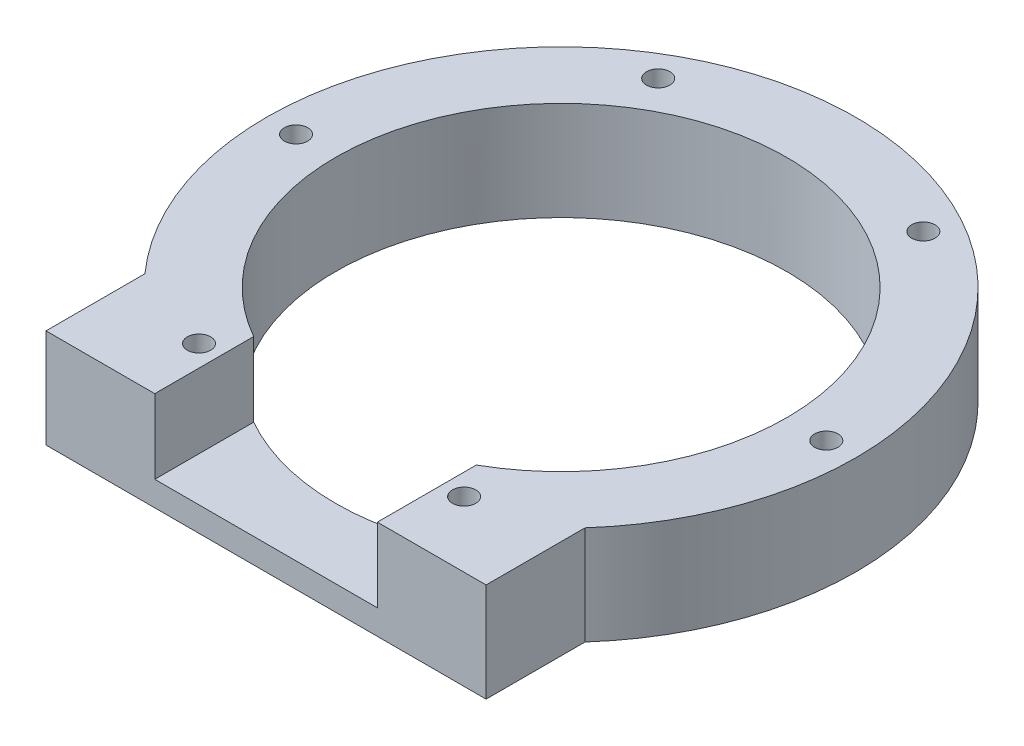
ISO-10303-21;
HEADER;
FILE_DESCRIPTION(('STEP AP214'),'2;1');
FILE_NAME('part.step','',(''),(''),'','','');
FILE_SCHEMA(('AUTOMOTIVE_DESIGN { 1 0 10303 214 1 1 1 1 }'));
ENDSEC;
DATA;
#1=APPLICATION_CONTEXT('core data for automotive mechanical design processes');
#2=APPLICATION_PROTOCOL_DEFINITION('international standard','automotive_design',2000,#1);
#3=PRODUCT_CONTEXT('',#1,'mechanical');
#4=PRODUCT('Part','Part','',(#3));
#5=PRODUCT_RELATED_PRODUCT_CATEGORY('part','',(#4));
#6=PRODUCT_DEFINITION_FORMATION('','',#4);
#7=PRODUCT_DEFINITION_CONTEXT('part definition',#1,'design');
#8=PRODUCT_DEFINITION('design','',#6,#7);
#9=PRODUCT_DEFINITION_SHAPE('','',#8);
#10=(LENGTH_UNIT() NAMED_UNIT(*) SI_UNIT(.MILLI.,.METRE.));
#11=(NAMED_UNIT(*) PLANE_ANGLE_UNIT() SI_UNIT($,.RADIAN.));
#12=(NAMED_UNIT(*) SI_UNIT($,.STERADIAN.) SOLID_ANGLE_UNIT());
#13=UNCERTAINTY_MEASURE_WITH_UNIT(LENGTH_MEASURE(1.E-05),#10,'distance_accuracy_value','');
#14=(GEOMETRIC_REPRESENTATION_CONTEXT(3) GLOBAL_UNCERTAINTY_ASSIGNED_CONTEXT((#13)) GLOBAL_UNIT_ASSIGNED_CONTEXT((#10,
#11,#12)) REPRESENTATION_CONTEXT('',''));
#15=CARTESIAN_POINT('',(0.,0.,0.));
#16=DIRECTION('',(0.,0.,1.));
#17=DIRECTION('',(1.,0.,0.));
#18=AXIS2_PLACEMENT_3D('',#15,#16,#17);
#19=CARTESIAN_POINT('',(14.2875,0.,37.8856562302831));
#20=DIRECTION('',(1.,0.,0.));
#21=DIRECTION('',(0.,0.,-1.));
#22=AXIS2_PLACEMENT_3D('',#19,#20,#21);
#23=PLANE('',#22);
#24=DIRECTION('',(0.,0.,-1.));
#25=VECTOR('',#24,1.);
#26=CARTESIAN_POINT('',(14.2875,3.175,0.));
#27=LINE('',#26,#25);
#28=CARTESIAN_POINT('',(14.2875,3.175,37.8856562302831));
#29=VERTEX_POINT('',#28);
#30=CARTESIAN_POINT('',(14.2875,3.175,25.1856562302831));
#31=VERTEX_POINT('',#30);
#32=EDGE_CURVE('E248',#29,#31,#27,.T.);
#33=ORIENTED_EDGE('',*,*,#32,.F.);
#34=DIRECTION('',(0.,-1.,0.));
#35=VECTOR('',#34,1.);
#36=CARTESIAN_POINT('',(14.2875,0.,37.8856562302831));
#37=LINE('',#36,#35);
#38=CARTESIAN_POINT('',(14.2875,12.7,37.8856562302831));
#39=VERTEX_POINT('',#38);
#40=EDGE_CURVE('E128',#39,#29,#37,.T.);
#41=ORIENTED_EDGE('',*,*,#40,.F.);
#42=DIRECTION('',(0.,0.,-1.));
#43=VECTOR('',#42,1.);
#44=CARTESIAN_POINT('',(14.2875,12.7,37.8856562302831));
#45=LINE('',#44,#43);
#46=CARTESIAN_POINT('',(14.2875,12.7,25.1856562302831));
#47=VERTEX_POINT('',#46);
#48=EDGE_CURVE('E123',#39,#47,#45,.T.);
#49=ORIENTED_EDGE('',*,*,#48,.T.);
#50=DIRECTION('',(0.,-1.,0.));
#51=VECTOR('',#50,1.);
#52=CARTESIAN_POINT('',(14.2875,12.7,25.1856562302831));
#53=LINE('',#52,#51);
#54=EDGE_CURVE('E11',#47,#31,#53,.T.);
#55=ORIENTED_EDGE('',*,*,#54,.T.);
#56=EDGE_LOOP('',(#33,#41,#49,#55));
#57=FACE_BOUND('',#56,.T.);
#58=ADVANCED_FACE('F46',(#57),#23,.F.);
#59=CARTESIAN_POINT('',(-14.2875,12.7,37.8856562302831));
#60=DIRECTION('',(-1.,0.,0.));
#61=DIRECTION('',(0.,0.,1.));
#62=AXIS2_PLACEMENT_3D('',#59,#60,#61);
#63=PLANE('',#62);
#64=DIRECTION('',(0.,0.,1.));
#65=VECTOR('',#64,1.);
#66=CARTESIAN_POINT('',(-14.2875,3.175,0.));
#67=LINE('',#66,#65);
#68=CARTESIAN_POINT('',(-14.2875,3.175,25.1856562302831));
#69=VERTEX_POINT('',#68);
#70=CARTESIAN_POINT('',(-14.2875,3.175,37.8856562302831));
#71=VERTEX_POINT('',#70);
#72=EDGE_CURVE('E62',#69,#71,#67,.T.);
#73=ORIENTED_EDGE('',*,*,#72,.F.);
#74=DIRECTION('',(0.,-1.,0.));
#75=VECTOR('',#74,1.);
#76=CARTESIAN_POINT('',(-14.2875,12.7,25.1856562302831));
#77=LINE('',#76,#75);
#78=CARTESIAN_POINT('',(-14.2875,12.7,25.1856562302831));
#79=VERTEX_POINT('',#78);
#80=EDGE_CURVE('E166',#79,#69,#77,.T.);
#81=ORIENTED_EDGE('',*,*,#80,.F.);
#82=DIRECTION('',(0.,0.,-1.));
#83=VECTOR('',#82,1.);
#84=CARTESIAN_POINT('',(-14.2875,12.7,37.8856562302831));
#85=LINE('',#84,#83);
#86=CARTESIAN_POINT('',(-14.2875,12.7,37.8856562302831));
#87=VERTEX_POINT('',#86);
#88=EDGE_CURVE('E185',#87,#79,#85,.T.);
#89=ORIENTED_EDGE('',*,*,#88,.F.);
#90=DIRECTION('',(0.,1.,0.));
#91=VECTOR('',#90,1.);
#92=CARTESIAN_POINT('',(-14.2875,12.7,37.8856562302831));
#93=LINE('',#92,#91);
#94=EDGE_CURVE('E195',#71,#87,#93,.T.);
#95=ORIENTED_EDGE('',*,*,#94,.F.);
#96=EDGE_LOOP('',(#73,#81,#89,#95));
#97=FACE_BOUND('',#96,.T.);
#98=ADVANCED_FACE('F278',(#97),#63,.F.);
#99=CARTESIAN_POINT('',(0.,0.,0.));
#100=DIRECTION('',(0.,1.,0.));
#101=DIRECTION('',(0.,0.,1.));
#102=AXIS2_PLACEMENT_3D('',#99,#100,#101);
#103=PLANE('',#102);
#104=CARTESIAN_POINT('',(0.,0.,0.));
#105=DIRECTION('',(0.,1.,0.));
#106=DIRECTION('',(0.,0.,1.));
#107=AXIS2_PLACEMENT_3D('',#104,#105,#106);
#108=CIRCLE('',#107,28.956);
#109=CARTESIAN_POINT('',(0.,0.,28.956));
#110=VERTEX_POINT('',#109);
#111=EDGE_CURVE('E167',#110,#110,#108,.T.);
#112=ORIENTED_EDGE('',*,*,#111,.T.);
#113=EDGE_LOOP('',(#112));
#114=FACE_BOUND('',#113,.T.);
#115=CARTESIAN_POINT('',(17.0180000000003,0.,-29.476040643207));
#116=DIRECTION('',(0.,-1.,0.));
#117=DIRECTION('',(0.,0.,-1.));
#118=AXIS2_PLACEMENT_3D('',#115,#116,#117);
#119=CIRCLE('',#118,1.5);
#120=CARTESIAN_POINT('',(17.0180000000003,0.,-30.976040643207));
#121=VERTEX_POINT('',#120);
#122=EDGE_CURVE('E241',#121,#121,#119,.T.);
#123=ORIENTED_EDGE('',*,*,#122,.F.);
#124=EDGE_LOOP('',(#123));
#125=FACE_BOUND('',#124,.T.);
#126=CARTESIAN_POINT('',(34.036,0.,0.));
#127=DIRECTION('',(0.,-1.,0.));
#128=DIRECTION('',(0.,0.,-1.));
#129=AXIS2_PLACEMENT_3D('',#126,#127,#128);
#130=CIRCLE('',#129,1.5);
#131=CARTESIAN_POINT('',(34.036,0.,-1.5));
#132=VERTEX_POINT('',#131);
#133=EDGE_CURVE('E233',#132,#132,#130,.T.);
#134=ORIENTED_EDGE('',*,*,#133,.F.);
#135=EDGE_LOOP('',(#134));
#136=FACE_BOUND('',#135,.T.);
#137=CARTESIAN_POINT('',(-34.036,0.,0.));
#138=DIRECTION('',(0.,-1.,0.));
#139=DIRECTION('',(0.,0.,-1.));
#140=AXIS2_PLACEMENT_3D('',#137,#138,#139);
#141=CIRCLE('',#140,1.5);
#142=CARTESIAN_POINT('',(-34.036,0.,-1.5));
#143=VERTEX_POINT('',#142);
#144=EDGE_CURVE('E217',#143,#143,#141,.T.);
#145=ORIENTED_EDGE('',*,*,#144,.F.);
#146=EDGE_LOOP('',(#145));
#147=FACE_BOUND('',#146,.T.);
#148=CARTESIAN_POINT('',(-17.0180000000001,0.,29.4760406432071));
#149=DIRECTION('',(0.,-1.,0.));
#150=DIRECTION('',(0.,0.,-1.));
#151=AXIS2_PLACEMENT_3D('',#148,#149,#150);
#152=CIRCLE('',#151,1.5);
#153=CARTESIAN_POINT('',(-17.0180000000001,0.,27.9760406432071));
#154=VERTEX_POINT('',#153);
#155=EDGE_CURVE('E209',#154,#154,#152,.T.);
#156=ORIENTED_EDGE('',*,*,#155,.F.);
#157=EDGE_LOOP('',(#156));
#158=FACE_BOUND('',#157,.T.);
#159=CARTESIAN_POINT('',(17.0179999999999,0.,29.4760406432072));
#160=DIRECTION('',(0.,-1.,0.));
#161=DIRECTION('',(0.,0.,-1.));
#162=AXIS2_PLACEMENT_3D('',#159,#160,#161);
#163=CIRCLE('',#162,1.5);
#164=CARTESIAN_POINT('',(17.0179999999999,0.,27.9760406432072));
#165=VERTEX_POINT('',#164);
#166=EDGE_CURVE('E149',#165,#165,#163,.T.);
#167=ORIENTED_EDGE('',*,*,#166,.F.);
#168=EDGE_LOOP('',(#167));
#169=FACE_BOUND('',#168,.T.);
#170=DIRECTION('',(0.,0.,-1.));
#171=VECTOR('',#170,1.);
#172=CARTESIAN_POINT('',(28.2489369047757,0.,37.8856562302831));
#173=LINE('',#172,#171);
#174=CARTESIAN_POINT('',(28.2489369047757,0.,37.8856562302831));
#175=VERTEX_POINT('',#174);
#176=CARTESIAN_POINT('',(28.2489369047757,0.,25.1856562302831));
#177=VERTEX_POINT('',#176);
#178=EDGE_CURVE('E146',#175,#177,#173,.T.);
#179=ORIENTED_EDGE('',*,*,#178,.F.);
#180=DIRECTION('',(1.,0.,0.));
#181=VECTOR('',#180,1.);
#182=CARTESIAN_POINT('',(-28.2489369047757,0.,37.8856562302831));
#183=LINE('',#182,#181);
#184=CARTESIAN_POINT('',(-28.2489369047757,0.,37.8856562302831));
#185=VERTEX_POINT('',#184);
#186=EDGE_CURVE('E133',#185,#175,#183,.T.);
#187=ORIENTED_EDGE('',*,*,#186,.F.);
#188=DIRECTION('',(0.,0.,-1.));
#189=VECTOR('',#188,1.);
#190=CARTESIAN_POINT('',(-28.2489369047757,0.,37.8856562302831));
#191=LINE('',#190,#189);
#192=CARTESIAN_POINT('',(-28.2489369047757,0.,25.1856562302831));
#193=VERTEX_POINT('',#192);
#194=EDGE_CURVE('E152',#185,#193,#191,.T.);
#195=ORIENTED_EDGE('',*,*,#194,.T.);
#196=CARTESIAN_POINT('',(0.,0.,0.));
#197=DIRECTION('',(0.,1.,0.));
#198=DIRECTION('',(0.,0.,1.));
#199=AXIS2_PLACEMENT_3D('',#196,#197,#198);
#200=CIRCLE('',#199,37.846);
#201=EDGE_CURVE('E163',#177,#193,#200,.T.);
#202=ORIENTED_EDGE('',*,*,#201,.F.);
#203=EDGE_LOOP('',(#179,#187,#195,#202));
#204=FACE_BOUND('',#203,.T.);
#205=CARTESIAN_POINT('',(-17.0179999999997,0.,-29.4760406432073));
#206=DIRECTION('',(0.,-1.,0.));
#207=DIRECTION('',(0.,0.,-1.));
#208=AXIS2_PLACEMENT_3D('',#205,#206,#207);
#209=CIRCLE('',#208,1.5);
#210=CARTESIAN_POINT('',(-17.0179999999997,0.,-30.9760406432073));
#211=VERTEX_POINT('',#210);
#212=EDGE_CURVE('E225',#211,#211,#209,.T.);
#213=ORIENTED_EDGE('',*,*,#212,.F.);
#214=EDGE_LOOP('',(#213));
#215=FACE_BOUND('',#214,.T.);
#216=ADVANCED_FACE('F181',(#114,#125,#136,#147,#158,#169,#204,#215),#103,.F.);
#217=CARTESIAN_POINT('',(0.,12.7,0.));
#218=DIRECTION('',(0.,-1.,0.));
#219=DIRECTION('',(0.,0.,-1.));
#220=AXIS2_PLACEMENT_3D('',#217,#218,#219);
#221=CYLINDRICAL_SURFACE('',#220,28.956);
#222=ORIENTED_EDGE('',*,*,#111,.F.);
#223=EDGE_LOOP('',(#222));
#224=FACE_BOUND('',#223,.T.);
#225=CARTESIAN_POINT('',(0.,3.175,0.));
#226=DIRECTION('',(0.,-1.,0.));
#227=DIRECTION('',(0.,0.,-1.));
#228=AXIS2_PLACEMENT_3D('',#225,#226,#227);
#229=CIRCLE('',#228,28.956);
#230=EDGE_CURVE('E252',#69,#31,#229,.F.);
#231=ORIENTED_EDGE('',*,*,#230,.T.);
#232=ORIENTED_EDGE('',*,*,#54,.F.);
#233=CARTESIAN_POINT('',(0.,12.7,0.));
#234=DIRECTION('',(0.,1.,0.));
#235=DIRECTION('',(0.,0.,1.));
#236=AXIS2_PLACEMENT_3D('',#233,#234,#235);
#237=CIRCLE('',#236,28.956);
#238=EDGE_CURVE('E159',#47,#79,#237,.T.);
#239=ORIENTED_EDGE('',*,*,#238,.T.);
#240=ORIENTED_EDGE('',*,*,#80,.T.);
#241=EDGE_LOOP('',(#231,#232,#239,#240));
#242=FACE_BOUND('',#241,.T.);
#243=ADVANCED_FACE('F48',(#224,#242),#221,.F.);
#244=CARTESIAN_POINT('',(0.,12.7,0.));
#245=DIRECTION('',(0.,-1.,0.));
#246=DIRECTION('',(0.,0.,-1.));
#247=AXIS2_PLACEMENT_3D('',#244,#245,#246);
#248=CYLINDRICAL_SURFACE('',#247,37.846);
#249=ORIENTED_EDGE('',*,*,#201,.T.);
#250=DIRECTION('',(0.,-1.,0.));
#251=VECTOR('',#250,1.);
#252=CARTESIAN_POINT('',(-28.2489369047757,12.7,25.1856562302831));
#253=LINE('',#252,#251);
#254=CARTESIAN_POINT('',(-28.2489369047757,12.7,25.1856562302831));
#255=VERTEX_POINT('',#254);
#256=EDGE_CURVE('E82',#255,#193,#253,.T.);
#257=ORIENTED_EDGE('',*,*,#256,.F.);
#258=CARTESIAN_POINT('',(0.,12.7,0.));
#259=DIRECTION('',(0.,1.,0.));
#260=DIRECTION('',(0.,0.,1.));
#261=AXIS2_PLACEMENT_3D('',#258,#259,#260);
#262=CIRCLE('',#261,37.846);
#263=CARTESIAN_POINT('',(28.2489369047757,12.7,25.1856562302831));
#264=VERTEX_POINT('',#263);
#265=EDGE_CURVE('E71',#264,#255,#262,.T.);
#266=ORIENTED_EDGE('',*,*,#265,.F.);
#267=DIRECTION('',(0.,-1.,0.));
#268=VECTOR('',#267,1.);
#269=CARTESIAN_POINT('',(28.2489369047757,12.7,25.1856562302831));
#270=LINE('',#269,#268);
#271=EDGE_CURVE('E55',#264,#177,#270,.T.);
#272=ORIENTED_EDGE('',*,*,#271,.T.);
#273=EDGE_LOOP('',(#249,#257,#266,#272));
#274=FACE_BOUND('',#273,.T.);
#275=ADVANCED_FACE('F179',(#274),#248,.T.);
#276=CARTESIAN_POINT('',(0.,12.7,0.));
#277=DIRECTION('',(0.,1.,0.));
#278=DIRECTION('',(0.,0.,1.));
#279=AXIS2_PLACEMENT_3D('',#276,#277,#278);
#280=PLANE('',#279);
#281=CARTESIAN_POINT('',(17.0180000000003,12.7,-29.476040643207));
#282=DIRECTION('',(0.,-1.,0.));
#283=DIRECTION('',(0.,0.,-1.));
#284=AXIS2_PLACEMENT_3D('',#281,#282,#283);
#285=CIRCLE('',#284,1.5);
#286=CARTESIAN_POINT('',(17.0180000000003,12.7,-30.976040643207));
#287=VERTEX_POINT('',#286);
#288=EDGE_CURVE('E237',#287,#287,#285,.T.);
#289=ORIENTED_EDGE('',*,*,#288,.T.);
#290=EDGE_LOOP('',(#289));
#291=FACE_BOUND('',#290,.T.);
#292=CARTESIAN_POINT('',(34.036,12.7,0.));
#293=DIRECTION('',(0.,-1.,0.));
#294=DIRECTION('',(0.,0.,-1.));
#295=AXIS2_PLACEMENT_3D('',#292,#293,#294);
#296=CIRCLE('',#295,1.49999999999999);
#297=CARTESIAN_POINT('',(34.036,12.7,-1.49999999999999));
#298=VERTEX_POINT('',#297);
#299=EDGE_CURVE('E229',#298,#298,#296,.T.);
#300=ORIENTED_EDGE('',*,*,#299,.T.);
#301=EDGE_LOOP('',(#300));
#302=FACE_BOUND('',#301,.T.);
#303=CARTESIAN_POINT('',(-17.0179999999997,12.7,-29.4760406432073));
#304=DIRECTION('',(0.,-1.,0.));
#305=DIRECTION('',(0.,0.,-1.));
#306=AXIS2_PLACEMENT_3D('',#303,#304,#305);
#307=CIRCLE('',#306,1.5);
#308=CARTESIAN_POINT('',(-17.0179999999997,12.7,-30.9760406432073));
#309=VERTEX_POINT('',#308);
#310=EDGE_CURVE('E221',#309,#309,#307,.T.);
#311=ORIENTED_EDGE('',*,*,#310,.T.);
#312=EDGE_LOOP('',(#311));
#313=FACE_BOUND('',#312,.T.);
#314=CARTESIAN_POINT('',(-34.036,12.7,0.));
#315=DIRECTION('',(0.,-1.,0.));
#316=DIRECTION('',(0.,0.,-1.));
#317=AXIS2_PLACEMENT_3D('',#314,#315,#316);
#318=CIRCLE('',#317,1.49999999999999);
#319=CARTESIAN_POINT('',(-34.036,12.7,-1.49999999999999));
#320=VERTEX_POINT('',#319);
#321=EDGE_CURVE('E213',#320,#320,#318,.T.);
#322=ORIENTED_EDGE('',*,*,#321,.T.);
#323=EDGE_LOOP('',(#322));
#324=FACE_BOUND('',#323,.T.);
#325=CARTESIAN_POINT('',(-17.0180000000001,12.7,29.4760406432071));
#326=DIRECTION('',(0.,-1.,0.));
#327=DIRECTION('',(0.,0.,-1.));
#328=AXIS2_PLACEMENT_3D('',#325,#326,#327);
#329=CIRCLE('',#328,1.5);
#330=CARTESIAN_POINT('',(-17.0180000000001,12.7,27.9760406432071));
#331=VERTEX_POINT('',#330);
#332=EDGE_CURVE('E205',#331,#331,#329,.T.);
#333=ORIENTED_EDGE('',*,*,#332,.T.);
#334=EDGE_LOOP('',(#333));
#335=FACE_BOUND('',#334,.T.);
#336=CARTESIAN_POINT('',(17.0179999999999,12.7,29.4760406432072));
#337=DIRECTION('',(0.,-1.,0.));
#338=DIRECTION('',(0.,0.,-1.));
#339=AXIS2_PLACEMENT_3D('',#336,#337,#338);
#340=CIRCLE('',#339,1.5);
#341=CARTESIAN_POINT('',(17.0179999999999,12.7,27.9760406432072));
#342=VERTEX_POINT('',#341);
#343=EDGE_CURVE('E142',#342,#342,#340,.T.);
#344=ORIENTED_EDGE('',*,*,#343,.T.);
#345=EDGE_LOOP('',(#344));
#346=FACE_BOUND('',#345,.T.);
#347=ORIENTED_EDGE('',*,*,#238,.F.);
#348=ORIENTED_EDGE('',*,*,#48,.F.);
#349=DIRECTION('',(-1.,0.,0.));
#350=VECTOR('',#349,1.);
#351=CARTESIAN_POINT('',(28.2489369047757,12.7,37.8856562302831));
#352=LINE('',#351,#350);
#353=CARTESIAN_POINT('',(28.2489369047757,12.7,37.8856562302831));
#354=VERTEX_POINT('',#353);
#355=EDGE_CURVE('E115',#354,#39,#352,.T.);
#356=ORIENTED_EDGE('',*,*,#355,.F.);
#357=DIRECTION('',(0.,0.,-1.));
#358=VECTOR('',#357,1.);
#359=CARTESIAN_POINT('',(28.2489369047757,12.7,37.8856562302831));
#360=LINE('',#359,#358);
#361=EDGE_CURVE('E120',#354,#264,#360,.T.);
#362=ORIENTED_EDGE('',*,*,#361,.T.);
#363=ORIENTED_EDGE('',*,*,#265,.T.);
#364=DIRECTION('',(0.,0.,-1.));
#365=VECTOR('',#364,1.);
#366=CARTESIAN_POINT('',(-28.2489369047757,12.7,37.8856562302831));
#367=LINE('',#366,#365);
#368=CARTESIAN_POINT('',(-28.2489369047757,12.7,37.8856562302831));
#369=VERTEX_POINT('',#368);
#370=EDGE_CURVE('E188',#369,#255,#367,.T.);
#371=ORIENTED_EDGE('',*,*,#370,.F.);
#372=DIRECTION('',(-1.,0.,0.));
#373=VECTOR('',#372,1.);
#374=CARTESIAN_POINT('',(-28.2489369047757,12.7,37.8856562302831));
#375=LINE('',#374,#373);
#376=EDGE_CURVE('E91',#87,#369,#375,.T.);
#377=ORIENTED_EDGE('',*,*,#376,.F.);
#378=ORIENTED_EDGE('',*,*,#88,.T.);
#379=EDGE_LOOP('',(#347,#348,#356,#362,#363,#371,#377,#378));
#380=FACE_BOUND('',#379,.T.);
#381=ADVANCED_FACE('F118',(#291,#302,#313,#324,#335,#346,#380),#280,.T.);
#382=CARTESIAN_POINT('',(28.2489369047757,0.,37.8856562302831));
#383=DIRECTION('',(-1.,0.,0.));
#384=DIRECTION('',(0.,0.,1.));
#385=AXIS2_PLACEMENT_3D('',#382,#383,#384);
#386=PLANE('',#385);
#387=ORIENTED_EDGE('',*,*,#271,.F.);
#388=ORIENTED_EDGE('',*,*,#361,.F.);
#389=DIRECTION('',(0.,1.,0.));
#390=VECTOR('',#389,1.);
#391=CARTESIAN_POINT('',(28.2489369047757,0.,37.8856562302831));
#392=LINE('',#391,#390);
#393=EDGE_CURVE('E127',#175,#354,#392,.T.);
#394=ORIENTED_EDGE('',*,*,#393,.F.);
#395=ORIENTED_EDGE('',*,*,#178,.T.);
#396=EDGE_LOOP('',(#387,#388,#394,#395));
#397=FACE_BOUND('',#396,.T.);
#398=ADVANCED_FACE('F140',(#397),#386,.F.);
#399=CARTESIAN_POINT('',(-28.2489369047757,12.7,37.8856562302831));
#400=DIRECTION('',(1.,0.,0.));
#401=DIRECTION('',(0.,0.,-1.));
#402=AXIS2_PLACEMENT_3D('',#399,#400,#401);
#403=PLANE('',#402);
#404=ORIENTED_EDGE('',*,*,#256,.T.);
#405=ORIENTED_EDGE('',*,*,#194,.F.);
#406=DIRECTION('',(0.,-1.,0.));
#407=VECTOR('',#406,1.);
#408=CARTESIAN_POINT('',(-28.2489369047757,12.7,37.8856562302831));
#409=LINE('',#408,#407);
#410=EDGE_CURVE('E138',#369,#185,#409,.T.);
#411=ORIENTED_EDGE('',*,*,#410,.F.);
#412=ORIENTED_EDGE('',*,*,#370,.T.);
#413=EDGE_LOOP('',(#404,#405,#411,#412));
#414=FACE_BOUND('',#413,.T.);
#415=ADVANCED_FACE('F324',(#414),#403,.F.);
#416=CARTESIAN_POINT('',(0.,0.,37.8856562302831));
#417=DIRECTION('',(0.,0.,1.));
#418=DIRECTION('',(1.,0.,0.));
#419=AXIS2_PLACEMENT_3D('',#416,#417,#418);
#420=PLANE('',#419);
#421=ORIENTED_EDGE('',*,*,#410,.T.);
#422=ORIENTED_EDGE('',*,*,#186,.T.);
#423=ORIENTED_EDGE('',*,*,#393,.T.);
#424=ORIENTED_EDGE('',*,*,#355,.T.);
#425=ORIENTED_EDGE('',*,*,#40,.T.);
#426=DIRECTION('',(1.,0.,0.));
#427=VECTOR('',#426,1.);
#428=CARTESIAN_POINT('',(0.,3.175,37.8856562302831));
#429=LINE('',#428,#427);
#430=EDGE_CURVE('E245',#71,#29,#429,.T.);
#431=ORIENTED_EDGE('',*,*,#430,.F.);
#432=ORIENTED_EDGE('',*,*,#94,.T.);
#433=ORIENTED_EDGE('',*,*,#376,.T.);
#434=EDGE_LOOP('',(#421,#422,#423,#424,#425,#431,#432,#433));
#435=FACE_BOUND('',#434,.T.);
#436=ADVANCED_FACE('F131',(#435),#420,.T.);
#437=CARTESIAN_POINT('',(17.0179999999999,0.,29.4760406432072));
#438=DIRECTION('',(0.,-1.,0.));
#439=DIRECTION('',(0.,0.,-1.));
#440=AXIS2_PLACEMENT_3D('',#437,#438,#439);
#441=CYLINDRICAL_SURFACE('',#440,1.5);
#442=ORIENTED_EDGE('',*,*,#343,.F.);
#443=EDGE_LOOP('',(#442));
#444=FACE_BOUND('',#443,.T.);
#445=ORIENTED_EDGE('',*,*,#166,.T.);
#446=EDGE_LOOP('',(#445));
#447=FACE_BOUND('',#446,.T.);
#448=ADVANCED_FACE('F313',(#444,#447),#441,.F.);
#449=CARTESIAN_POINT('',(-17.0180000000001,0.,29.4760406432071));
#450=DIRECTION('',(0.,-1.,0.));
#451=DIRECTION('',(0.,0.,-1.));
#452=AXIS2_PLACEMENT_3D('',#449,#450,#451);
#453=CYLINDRICAL_SURFACE('',#452,1.5);
#454=ORIENTED_EDGE('',*,*,#332,.F.);
#455=EDGE_LOOP('',(#454));
#456=FACE_BOUND('',#455,.T.);
#457=ORIENTED_EDGE('',*,*,#155,.T.);
#458=EDGE_LOOP('',(#457));
#459=FACE_BOUND('',#458,.T.);
#460=ADVANCED_FACE('F315',(#456,#459),#453,.F.);
#461=CARTESIAN_POINT('',(-34.036,0.,0.));
#462=DIRECTION('',(0.,-1.,0.));
#463=DIRECTION('',(0.,0.,-1.));
#464=AXIS2_PLACEMENT_3D('',#461,#462,#463);
#465=CYLINDRICAL_SURFACE('',#464,1.5);
#466=ORIENTED_EDGE('',*,*,#321,.F.);
#467=EDGE_LOOP('',(#466));
#468=FACE_BOUND('',#467,.T.);
#469=ORIENTED_EDGE('',*,*,#144,.T.);
#470=EDGE_LOOP('',(#469));
#471=FACE_BOUND('',#470,.T.);
#472=ADVANCED_FACE('F321',(#468,#471),#465,.F.);
#473=CARTESIAN_POINT('',(-17.0179999999997,0.,-29.4760406432073));
#474=DIRECTION('',(0.,-1.,0.));
#475=DIRECTION('',(0.,0.,-1.));
#476=AXIS2_PLACEMENT_3D('',#473,#474,#475);
#477=CYLINDRICAL_SURFACE('',#476,1.5);
#478=ORIENTED_EDGE('',*,*,#310,.F.);
#479=EDGE_LOOP('',(#478));
#480=FACE_BOUND('',#479,.T.);
#481=ORIENTED_EDGE('',*,*,#212,.T.);
#482=EDGE_LOOP('',(#481));
#483=FACE_BOUND('',#482,.T.);
#484=ADVANCED_FACE('F384',(#480,#483),#477,.F.);
#485=CARTESIAN_POINT('',(34.036,0.,0.));
#486=DIRECTION('',(0.,-1.,0.));
#487=DIRECTION('',(0.,0.,-1.));
#488=AXIS2_PLACEMENT_3D('',#485,#486,#487);
#489=CYLINDRICAL_SURFACE('',#488,1.5);
#490=ORIENTED_EDGE('',*,*,#299,.F.);
#491=EDGE_LOOP('',(#490));
#492=FACE_BOUND('',#491,.T.);
#493=ORIENTED_EDGE('',*,*,#133,.T.);
#494=EDGE_LOOP('',(#493));
#495=FACE_BOUND('',#494,.T.);
#496=ADVANCED_FACE('F274',(#492,#495),#489,.F.);
#497=CARTESIAN_POINT('',(17.0180000000003,0.,-29.476040643207));
#498=DIRECTION('',(0.,-1.,0.));
#499=DIRECTION('',(0.,0.,-1.));
#500=AXIS2_PLACEMENT_3D('',#497,#498,#499);
#501=CYLINDRICAL_SURFACE('',#500,1.5);
#502=ORIENTED_EDGE('',*,*,#288,.F.);
#503=EDGE_LOOP('',(#502));
#504=FACE_BOUND('',#503,.T.);
#505=ORIENTED_EDGE('',*,*,#122,.T.);
#506=EDGE_LOOP('',(#505));
#507=FACE_BOUND('',#506,.T.);
#508=ADVANCED_FACE('F268',(#504,#507),#501,.F.);
#509=CARTESIAN_POINT('',(0.,3.175,0.));
#510=DIRECTION('',(0.,-1.,0.));
#511=DIRECTION('',(0.,0.,-1.));
#512=AXIS2_PLACEMENT_3D('',#509,#510,#511);
#513=PLANE('',#512);
#514=ORIENTED_EDGE('',*,*,#72,.T.);
#515=ORIENTED_EDGE('',*,*,#430,.T.);
#516=ORIENTED_EDGE('',*,*,#32,.T.);
#517=ORIENTED_EDGE('',*,*,#230,.F.);
#518=EDGE_LOOP('',(#514,#515,#516,#517));
#519=FACE_BOUND('',#518,.T.);
#520=ADVANCED_FACE('F266',(#519),#513,.F.);
#521=CLOSED_SHELL('',(#58,#98,#216,#243,#275,#381,#398,#415,#436,#448,#460,#472,#484,#496,#508,#520));
#522=MANIFOLD_SOLID_BREP('B2',#521);
#523=ADVANCED_BREP_SHAPE_REPRESENTATION('',(#18,#522),#14);
#524=SHAPE_DEFINITION_REPRESENTATION(#9,#523);
ENDSEC;
END-ISO-10303-21;
